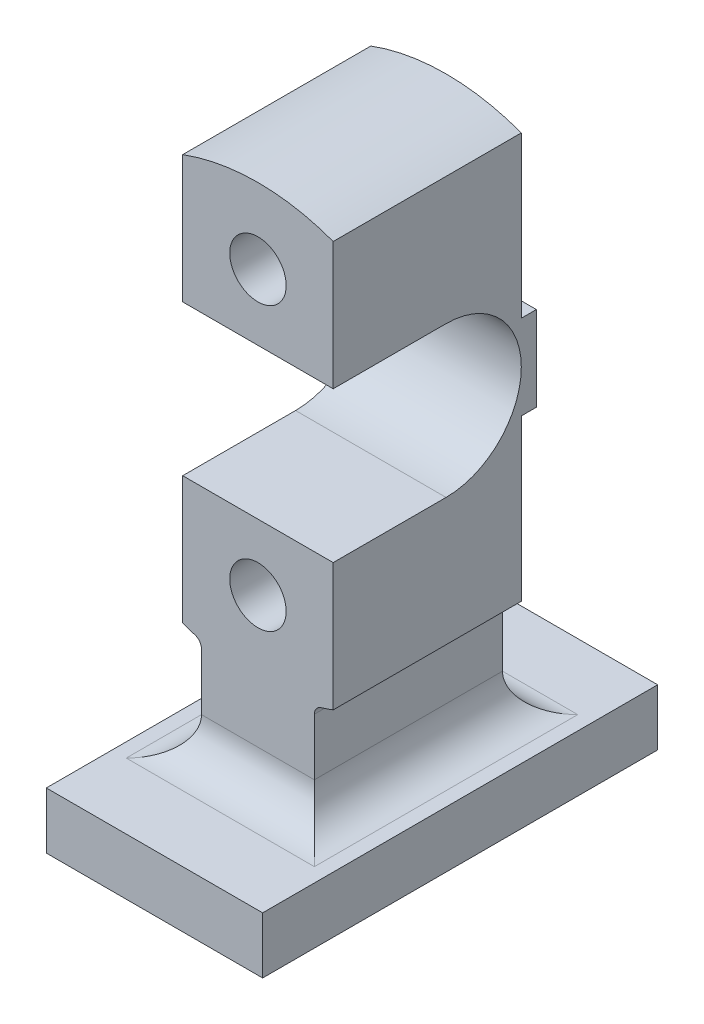
ISO-10303-21;
HEADER;
FILE_DESCRIPTION(('STEP AP214'),'2;1');
FILE_NAME('part.step','',(''),(''),'','','');
FILE_SCHEMA(('AUTOMOTIVE_DESIGN { 1 0 10303 214 1 1 1 1 }'));
ENDSEC;
DATA;
#1=APPLICATION_CONTEXT('core data for automotive mechanical design processes');
#2=APPLICATION_PROTOCOL_DEFINITION('international standard','automotive_design',2000,#1);
#3=PRODUCT_CONTEXT('',#1,'mechanical');
#4=PRODUCT('Part','Part','',(#3));
#5=PRODUCT_RELATED_PRODUCT_CATEGORY('part','',(#4));
#6=PRODUCT_DEFINITION_FORMATION('','',#4);
#7=PRODUCT_DEFINITION_CONTEXT('part definition',#1,'design');
#8=PRODUCT_DEFINITION('design','',#6,#7);
#9=PRODUCT_DEFINITION_SHAPE('','',#8);
#10=(LENGTH_UNIT() NAMED_UNIT(*) SI_UNIT(.MILLI.,.METRE.));
#11=(NAMED_UNIT(*) PLANE_ANGLE_UNIT() SI_UNIT($,.RADIAN.));
#12=(NAMED_UNIT(*) SI_UNIT($,.STERADIAN.) SOLID_ANGLE_UNIT());
#13=UNCERTAINTY_MEASURE_WITH_UNIT(LENGTH_MEASURE(1.E-05),#10,'distance_accuracy_value','');
#14=(GEOMETRIC_REPRESENTATION_CONTEXT(3) GLOBAL_UNCERTAINTY_ASSIGNED_CONTEXT((#13)) GLOBAL_UNIT_ASSIGNED_CONTEXT((#10,
#11,#12)) REPRESENTATION_CONTEXT('',''));
#15=CARTESIAN_POINT('',(0.,0.,0.));
#16=DIRECTION('',(0.,0.,1.));
#17=DIRECTION('',(1.,0.,0.));
#18=AXIS2_PLACEMENT_3D('',#15,#16,#17);
#19=CARTESIAN_POINT('',(-57.5,304.92444078651,-55.));
#20=DIRECTION('',(0.,0.,1.));
#21=DIRECTION('',(0.,-1.,0.));
#22=AXIS2_PLACEMENT_3D('',#19,#20,#21);
#23=PLANE('',#22);
#24=DIRECTION('',(1.,0.,0.));
#25=VECTOR('',#24,1.);
#26=CARTESIAN_POINT('',(-57.5,220.,-55.));
#27=LINE('',#26,#25);
#28=CARTESIAN_POINT('',(-40.,220.,-55.));
#29=VERTEX_POINT('',#28);
#30=CARTESIAN_POINT('',(40.,220.,-55.));
#31=VERTEX_POINT('',#30);
#32=EDGE_CURVE('E360',#29,#31,#27,.T.);
#33=ORIENTED_EDGE('',*,*,#32,.T.);
#34=DIRECTION('',(0.,-1.,0.));
#35=VECTOR('',#34,1.);
#36=CARTESIAN_POINT('',(40.,304.92444078651,-55.));
#37=LINE('',#36,#35);
#38=CARTESIAN_POINT('',(40.,287.819293264239,-55.));
#39=VERTEX_POINT('',#38);
#40=EDGE_CURVE('E228',#39,#31,#37,.T.);
#41=ORIENTED_EDGE('',*,*,#40,.F.);
#42=CARTESIAN_POINT('',(0.,180.,-55.));
#43=DIRECTION('',(0.,0.,1.));
#44=DIRECTION('',(0.,-1.,0.));
#45=AXIS2_PLACEMENT_3D('',#42,#43,#44);
#46=CIRCLE('',#45,115.);
#47=CARTESIAN_POINT('',(-40.,287.819293264239,-55.));
#48=VERTEX_POINT('',#47);
#49=EDGE_CURVE('E253',#39,#48,#46,.T.);
#50=ORIENTED_EDGE('',*,*,#49,.T.);
#51=DIRECTION('',(0.,1.,0.));
#52=VECTOR('',#51,1.);
#53=CARTESIAN_POINT('',(-40.,0.,-55.));
#54=LINE('',#53,#52);
#55=EDGE_CURVE('E245',#29,#48,#54,.T.);
#56=ORIENTED_EDGE('',*,*,#55,.F.);
#57=EDGE_LOOP('',(#33,#41,#50,#56));
#58=FACE_BOUND('',#57,.T.);
#59=CARTESIAN_POINT('',(0.,255.,-55.));
#60=DIRECTION('',(0.,0.,1.));
#61=DIRECTION('',(0.,-1.,0.));
#62=AXIS2_PLACEMENT_3D('',#59,#60,#61);
#63=CIRCLE('',#62,15.);
#64=CARTESIAN_POINT('',(15.,255.,-55.));
#65=VERTEX_POINT('',#64);
#66=EDGE_CURVE('E256',#65,#65,#63,.F.);
#67=ORIENTED_EDGE('',*,*,#66,.T.);
#68=EDGE_LOOP('',(#67));
#69=FACE_BOUND('',#68,.T.);
#70=ADVANCED_FACE('F42',(#58,#69),#23,.T.);
#71=CARTESIAN_POINT('',(-57.5,304.92444078651,-155.));
#72=DIRECTION('',(0.,0.,-1.));
#73=DIRECTION('',(0.,1.,0.));
#74=AXIS2_PLACEMENT_3D('',#71,#72,#73);
#75=PLANE('',#74);
#76=DIRECTION('',(1.,0.,0.));
#77=VECTOR('',#76,1.);
#78=CARTESIAN_POINT('',(-85.7055795281057,157.5,-155.));
#79=LINE('',#78,#77);
#80=CARTESIAN_POINT('',(-40.,157.5,-155.));
#81=VERTEX_POINT('',#80);
#82=CARTESIAN_POINT('',(40.,157.5,-155.));
#83=VERTEX_POINT('',#82);
#84=EDGE_CURVE('E65',#81,#83,#79,.T.);
#85=ORIENTED_EDGE('',*,*,#84,.T.);
#86=DIRECTION('',(0.,1.,0.));
#87=VECTOR('',#86,1.);
#88=CARTESIAN_POINT('',(40.,304.92444078651,-155.));
#89=LINE('',#88,#87);
#90=CARTESIAN_POINT('',(40.,72.1807067357609,-155.));
#91=VERTEX_POINT('',#90);
#92=EDGE_CURVE('E238',#91,#83,#89,.T.);
#93=ORIENTED_EDGE('',*,*,#92,.F.);
#94=CARTESIAN_POINT('',(0.,180.,-155.));
#95=DIRECTION('',(0.,0.,-1.));
#96=DIRECTION('',(0.,1.,0.));
#97=AXIS2_PLACEMENT_3D('',#94,#95,#96);
#98=CIRCLE('',#97,115.);
#99=CARTESIAN_POINT('',(33.5416666666667,70.0001972855304,-155.));
#100=VERTEX_POINT('',#99);
#101=EDGE_CURVE('E291',#100,#91,#98,.F.);
#102=ORIENTED_EDGE('',*,*,#101,.F.);
#103=CARTESIAN_POINT('',(35.,65.21759716751,-155.));
#104=DIRECTION('',(0.,0.,-1.));
#105=DIRECTION('',(0.,1.,0.));
#106=AXIS2_PLACEMENT_3D('',#103,#104,#105);
#107=CIRCLE('',#106,5.);
#108=CARTESIAN_POINT('',(30.,65.21759716751,-155.));
#109=VERTEX_POINT('',#108);
#110=EDGE_CURVE('E288',#109,#100,#107,.T.);
#111=ORIENTED_EDGE('',*,*,#110,.F.);
#112=DIRECTION('',(0.,-1.,0.));
#113=VECTOR('',#112,1.);
#114=CARTESIAN_POINT('',(30.,0.,-155.));
#115=LINE('',#114,#113);
#116=CARTESIAN_POINT('',(30.,35.,-155.));
#117=VERTEX_POINT('',#116);
#118=EDGE_CURVE('E285',#109,#117,#115,.T.);
#119=ORIENTED_EDGE('',*,*,#118,.T.);
#120=DIRECTION('',(1.,0.,0.));
#121=VECTOR('',#120,1.);
#122=CARTESIAN_POINT('',(-30.,35.,-155.));
#123=LINE('',#122,#121);
#124=CARTESIAN_POINT('',(-30.,35.,-155.));
#125=VERTEX_POINT('',#124);
#126=EDGE_CURVE('E330',#117,#125,#123,.F.);
#127=ORIENTED_EDGE('',*,*,#126,.T.);
#128=DIRECTION('',(0.,-1.,0.));
#129=VECTOR('',#128,1.);
#130=CARTESIAN_POINT('',(-30.,0.,-155.));
#131=LINE('',#130,#129);
#132=CARTESIAN_POINT('',(-30.,65.21759716751,-155.));
#133=VERTEX_POINT('',#132);
#134=EDGE_CURVE('E276',#133,#125,#131,.T.);
#135=ORIENTED_EDGE('',*,*,#134,.F.);
#136=CARTESIAN_POINT('',(-35.,65.21759716751,-155.));
#137=DIRECTION('',(0.,0.,-1.));
#138=DIRECTION('',(0.,1.,0.));
#139=AXIS2_PLACEMENT_3D('',#136,#137,#138);
#140=CIRCLE('',#139,5.);
#141=CARTESIAN_POINT('',(-33.5416666666667,70.0001972855304,-155.));
#142=VERTEX_POINT('',#141);
#143=EDGE_CURVE('E273',#142,#133,#140,.T.);
#144=ORIENTED_EDGE('',*,*,#143,.F.);
#145=CARTESIAN_POINT('',(0.,180.,-155.));
#146=DIRECTION('',(0.,0.,-1.));
#147=DIRECTION('',(0.,1.,0.));
#148=AXIS2_PLACEMENT_3D('',#145,#146,#147);
#149=CIRCLE('',#148,115.);
#150=CARTESIAN_POINT('',(-40.,72.1807067357609,-155.));
#151=VERTEX_POINT('',#150);
#152=EDGE_CURVE('E269',#151,#142,#149,.F.);
#153=ORIENTED_EDGE('',*,*,#152,.F.);
#154=DIRECTION('',(0.,-1.,0.));
#155=VECTOR('',#154,1.);
#156=CARTESIAN_POINT('',(-40.,0.,-155.));
#157=LINE('',#156,#155);
#158=EDGE_CURVE('E270',#81,#151,#157,.T.);
#159=ORIENTED_EDGE('',*,*,#158,.F.);
#160=EDGE_LOOP('',(#85,#93,#102,#111,#119,#127,#135,#144,#153,#159));
#161=FACE_BOUND('',#160,.T.);
#162=CARTESIAN_POINT('',(0.,105.,-155.));
#163=DIRECTION('',(0.,0.,-1.));
#164=DIRECTION('',(0.,1.,0.));
#165=AXIS2_PLACEMENT_3D('',#162,#163,#164);
#166=CIRCLE('',#165,15.);
#167=CARTESIAN_POINT('',(15.,105.,-155.));
#168=VERTEX_POINT('',#167);
#169=EDGE_CURVE('E265',#168,#168,#166,.F.);
#170=ORIENTED_EDGE('',*,*,#169,.T.);
#171=EDGE_LOOP('',(#170));
#172=FACE_BOUND('',#171,.T.);
#173=ADVANCED_FACE('F444',(#161,#172),#75,.T.);
#174=CARTESIAN_POINT('',(0.,105.,-210.));
#175=DIRECTION('',(0.,0.,1.));
#176=DIRECTION('',(1.,0.,0.));
#177=AXIS2_PLACEMENT_3D('',#174,#175,#176);
#178=CYLINDRICAL_SURFACE('',#177,15.);
#179=CARTESIAN_POINT('',(0.,105.,-55.));
#180=DIRECTION('',(0.,0.,1.));
#181=DIRECTION('',(0.,-1.,0.));
#182=AXIS2_PLACEMENT_3D('',#179,#180,#181);
#183=CIRCLE('',#182,15.);
#184=CARTESIAN_POINT('',(15.,105.,-55.));
#185=VERTEX_POINT('',#184);
#186=EDGE_CURVE('E241',#185,#185,#183,.F.);
#187=CARTESIAN_POINT('',(15.,105.,-55.));
#188=CARTESIAN_POINT('',(15.,105.,-56.0416666666667));
#189=CARTESIAN_POINT('',(15.,105.,-57.0833333333333));
#190=CARTESIAN_POINT('',(15.,105.,-59.1666666666667));
#191=CARTESIAN_POINT('',(15.,105.,-60.2083333333334));
#192=CARTESIAN_POINT('',(15.,105.,-62.2916666666667));
#193=CARTESIAN_POINT('',(15.,105.,-63.3333333333333));
#194=CARTESIAN_POINT('',(15.,105.,-65.4166666666667));
#195=CARTESIAN_POINT('',(15.,105.,-66.4583333333334));
#196=CARTESIAN_POINT('',(15.,105.,-68.5416666666667));
#197=CARTESIAN_POINT('',(15.,105.,-69.5833333333334));
#198=CARTESIAN_POINT('',(15.,105.,-71.6666666666667));
#199=CARTESIAN_POINT('',(15.,105.,-72.7083333333333));
#200=CARTESIAN_POINT('',(15.,105.,-74.7916666666667));
#201=CARTESIAN_POINT('',(15.,105.,-75.8333333333333));
#202=CARTESIAN_POINT('',(15.,105.,-77.9166666666667));
#203=CARTESIAN_POINT('',(15.,105.,-78.9583333333334));
#204=CARTESIAN_POINT('',(15.,105.,-81.0416666666667));
#205=CARTESIAN_POINT('',(15.,105.,-82.0833333333334));
#206=CARTESIAN_POINT('',(15.,105.,-84.1666666666667));
#207=CARTESIAN_POINT('',(15.,105.,-85.2083333333334));
#208=CARTESIAN_POINT('',(15.,105.,-87.2916666666667));
#209=CARTESIAN_POINT('',(15.,105.,-88.3333333333334));
#210=CARTESIAN_POINT('',(15.,105.,-90.4166666666667));
#211=CARTESIAN_POINT('',(15.,105.,-91.4583333333334));
#212=CARTESIAN_POINT('',(15.,105.,-93.5416666666667));
#213=CARTESIAN_POINT('',(15.,105.,-94.5833333333334));
#214=CARTESIAN_POINT('',(15.,105.,-96.6666666666667));
#215=CARTESIAN_POINT('',(15.,105.,-97.7083333333334));
#216=CARTESIAN_POINT('',(15.,105.,-99.7916666666667));
#217=CARTESIAN_POINT('',(15.,105.,-100.833333333333));
#218=CARTESIAN_POINT('',(15.,105.,-102.916666666667));
#219=CARTESIAN_POINT('',(15.,105.,-103.958333333333));
#220=CARTESIAN_POINT('',(15.,105.,-106.041666666667));
#221=CARTESIAN_POINT('',(15.,105.,-107.083333333333));
#222=CARTESIAN_POINT('',(15.,105.,-109.166666666667));
#223=CARTESIAN_POINT('',(15.,105.,-110.208333333333));
#224=CARTESIAN_POINT('',(15.,105.,-112.291666666667));
#225=CARTESIAN_POINT('',(15.,105.,-113.333333333333));
#226=CARTESIAN_POINT('',(15.,105.,-115.416666666667));
#227=CARTESIAN_POINT('',(15.,105.,-116.458333333333));
#228=CARTESIAN_POINT('',(15.,105.,-118.541666666667));
#229=CARTESIAN_POINT('',(15.,105.,-119.583333333333));
#230=CARTESIAN_POINT('',(15.,105.,-121.666666666667));
#231=CARTESIAN_POINT('',(15.,105.,-122.708333333333));
#232=CARTESIAN_POINT('',(15.,105.,-124.791666666667));
#233=CARTESIAN_POINT('',(15.,105.,-125.833333333333));
#234=CARTESIAN_POINT('',(15.,105.,-127.916666666667));
#235=CARTESIAN_POINT('',(15.,105.,-128.958333333333));
#236=CARTESIAN_POINT('',(15.,105.,-131.041666666667));
#237=CARTESIAN_POINT('',(15.,105.,-132.083333333333));
#238=CARTESIAN_POINT('',(15.,105.,-134.166666666667));
#239=CARTESIAN_POINT('',(15.,105.,-135.208333333333));
#240=CARTESIAN_POINT('',(15.,105.,-137.291666666667));
#241=CARTESIAN_POINT('',(15.,105.,-138.333333333333));
#242=CARTESIAN_POINT('',(15.,105.,-140.416666666667));
#243=CARTESIAN_POINT('',(15.,105.,-141.458333333333));
#244=CARTESIAN_POINT('',(15.,105.,-143.541666666667));
#245=CARTESIAN_POINT('',(15.,105.,-144.583333333333));
#246=CARTESIAN_POINT('',(15.,105.,-146.666666666667));
#247=CARTESIAN_POINT('',(15.,105.,-147.708333333333));
#248=CARTESIAN_POINT('',(15.,105.,-149.791666666667));
#249=CARTESIAN_POINT('',(15.,105.,-150.833333333333));
#250=CARTESIAN_POINT('',(15.,105.,-152.916666666667));
#251=CARTESIAN_POINT('',(15.,105.,-153.958333333333));
#252=CARTESIAN_POINT('',(15.,105.,-155.));
#253=B_SPLINE_CURVE_WITH_KNOTS('',3,(#187,#188,#189,#190,#191,#192,#193,#194,#195,#196,#197,
#198,#199,#200,#201,#202,#203,#204,#205,#206,#207,#208,#209,#210,#211,#212,#213,#214,#215,#216,
#217,#218,#219,#220,#221,#222,#223,#224,#225,#226,#227,#228,#229,#230,#231,#232,#233,#234,#235,
#236,#237,#238,#239,#240,#241,#242,#243,#244,#245,#246,#247,#248,#249,#250,#251,#252),
.UNSPECIFIED.,.F.,.F.,(4,2,2,2,2,2,2,2,2,2,2,2,2,2,2,2,2,2,2,2,2,2,2,2,2,2,2,2,2,2,2,2,4),(0.,
3.12499999999999,6.25000000000001,9.37499999999999,12.5,15.625,18.75,21.875,25.,28.125,31.25,
34.375,37.5,40.625,43.75,46.875,50.,53.125,56.25,59.375,62.5,65.625,68.75,71.875,75.,78.125,
81.25,84.375,87.5,90.625,93.75,96.875,100.),.UNSPECIFIED.);
#254=EDGE_CURVE('BSEAM450',#185,#168,#253,.T.);
#255=ORIENTED_EDGE('',*,*,#186,.F.);
#256=ORIENTED_EDGE('',*,*,#169,.F.);
#257=ORIENTED_EDGE('',*,*,#254,.T.);
#258=ORIENTED_EDGE('',*,*,#254,.F.);
#259=EDGE_LOOP('',(#255,#257,#256,#258));
#260=FACE_BOUND('',#259,.T.);
#261=ADVANCED_FACE('F450',(#260),#178,.F.);
#262=DIRECTION('',(1.,0.,0.));
#263=VECTOR('',#262,1.);
#264=CARTESIAN_POINT('',(-85.7055795281057,202.5,-155.));
#265=LINE('',#264,#263);
#266=CARTESIAN_POINT('',(-40.,202.5,-155.));
#267=VERTEX_POINT('',#266);
#268=CARTESIAN_POINT('',(40.,202.5,-155.));
#269=VERTEX_POINT('',#268);
#270=EDGE_CURVE('E381',#267,#269,#265,.T.);
#271=ORIENTED_EDGE('',*,*,#270,.F.);
#272=CARTESIAN_POINT('',(-40.,287.819293264239,-155.));
#273=VERTEX_POINT('',#272);
#274=EDGE_CURVE('E266',#273,#267,#157,.T.);
#275=ORIENTED_EDGE('',*,*,#274,.F.);
#276=CARTESIAN_POINT('',(0.,180.,-155.));
#277=DIRECTION('',(0.,0.,-1.));
#278=DIRECTION('',(0.,1.,0.));
#279=AXIS2_PLACEMENT_3D('',#276,#277,#278);
#280=CIRCLE('',#279,115.);
#281=CARTESIAN_POINT('',(40.,287.819293264239,-155.));
#282=VERTEX_POINT('',#281);
#283=EDGE_CURVE('E279',#273,#282,#280,.T.);
#284=ORIENTED_EDGE('',*,*,#283,.T.);
#285=EDGE_CURVE('E231',#269,#282,#89,.T.);
#286=ORIENTED_EDGE('',*,*,#285,.F.);
#287=EDGE_LOOP('',(#271,#275,#284,#286));
#288=FACE_BOUND('',#287,.T.);
#289=CARTESIAN_POINT('',(0.,255.,-155.));
#290=DIRECTION('',(0.,0.,-1.));
#291=DIRECTION('',(0.,1.,0.));
#292=AXIS2_PLACEMENT_3D('',#289,#290,#291);
#293=CIRCLE('',#292,15.);
#294=CARTESIAN_POINT('',(15.,255.,-155.));
#295=VERTEX_POINT('',#294);
#296=EDGE_CURVE('E282',#295,#295,#293,.F.);
#297=ORIENTED_EDGE('',*,*,#296,.T.);
#298=EDGE_LOOP('',(#297));
#299=FACE_BOUND('',#298,.T.);
#300=ADVANCED_FACE('F453',(#288,#299),#75,.T.);
#301=DIRECTION('',(1.,0.,0.));
#302=VECTOR('',#301,1.);
#303=CARTESIAN_POINT('',(-57.5,140.,-55.));
#304=LINE('',#303,#302);
#305=CARTESIAN_POINT('',(-40.,140.,-55.));
#306=VERTEX_POINT('',#305);
#307=CARTESIAN_POINT('',(40.,140.,-55.));
#308=VERTEX_POINT('',#307);
#309=EDGE_CURVE('E201',#306,#308,#304,.T.);
#310=ORIENTED_EDGE('',*,*,#309,.F.);
#311=CARTESIAN_POINT('',(-40.,72.1807067357609,-55.));
#312=VERTEX_POINT('',#311);
#313=EDGE_CURVE('E242',#312,#306,#54,.T.);
#314=ORIENTED_EDGE('',*,*,#313,.F.);
#315=CARTESIAN_POINT('',(0.,180.,-55.));
#316=DIRECTION('',(0.,0.,1.));
#317=DIRECTION('',(0.,-1.,0.));
#318=AXIS2_PLACEMENT_3D('',#315,#316,#317);
#319=CIRCLE('',#318,115.);
#320=CARTESIAN_POINT('',(-33.5416666666667,70.0001972855304,-55.));
#321=VERTEX_POINT('',#320);
#322=EDGE_CURVE('E244',#321,#312,#319,.F.);
#323=ORIENTED_EDGE('',*,*,#322,.F.);
#324=CARTESIAN_POINT('',(-35.,65.21759716751,-55.));
#325=DIRECTION('',(0.,0.,1.));
#326=DIRECTION('',(0.,-1.,0.));
#327=AXIS2_PLACEMENT_3D('',#324,#325,#326);
#328=CIRCLE('',#327,5.);
#329=CARTESIAN_POINT('',(-30.,65.21759716751,-55.));
#330=VERTEX_POINT('',#329);
#331=EDGE_CURVE('E248',#330,#321,#328,.T.);
#332=ORIENTED_EDGE('',*,*,#331,.F.);
#333=DIRECTION('',(0.,1.,0.));
#334=VECTOR('',#333,1.);
#335=CARTESIAN_POINT('',(-30.,0.,-55.));
#336=LINE('',#335,#334);
#337=CARTESIAN_POINT('',(-30.,35.,-55.));
#338=VERTEX_POINT('',#337);
#339=EDGE_CURVE('E251',#338,#330,#336,.T.);
#340=ORIENTED_EDGE('',*,*,#339,.F.);
#341=DIRECTION('',(1.,0.,0.));
#342=VECTOR('',#341,1.);
#343=CARTESIAN_POINT('',(30.,35.,-55.));
#344=LINE('',#343,#342);
#345=CARTESIAN_POINT('',(30.,35.,-55.));
#346=VERTEX_POINT('',#345);
#347=EDGE_CURVE('E335',#338,#346,#344,.T.);
#348=ORIENTED_EDGE('',*,*,#347,.T.);
#349=DIRECTION('',(0.,1.,0.));
#350=VECTOR('',#349,1.);
#351=CARTESIAN_POINT('',(30.,0.,-55.));
#352=LINE('',#351,#350);
#353=CARTESIAN_POINT('',(30.,65.21759716751,-55.));
#354=VERTEX_POINT('',#353);
#355=EDGE_CURVE('E259',#346,#354,#352,.T.);
#356=ORIENTED_EDGE('',*,*,#355,.T.);
#357=CARTESIAN_POINT('',(35.,65.21759716751,-55.));
#358=DIRECTION('',(0.,0.,1.));
#359=DIRECTION('',(0.,-1.,0.));
#360=AXIS2_PLACEMENT_3D('',#357,#358,#359);
#361=CIRCLE('',#360,5.);
#362=CARTESIAN_POINT('',(33.5416666666667,70.0001972855304,-55.));
#363=VERTEX_POINT('',#362);
#364=EDGE_CURVE('E261',#363,#354,#361,.T.);
#365=ORIENTED_EDGE('',*,*,#364,.F.);
#366=CARTESIAN_POINT('',(0.,180.,-55.));
#367=DIRECTION('',(0.,0.,1.));
#368=DIRECTION('',(0.,-1.,0.));
#369=AXIS2_PLACEMENT_3D('',#366,#367,#368);
#370=CIRCLE('',#369,115.);
#371=CARTESIAN_POINT('',(40.,72.1807067357609,-55.));
#372=VERTEX_POINT('',#371);
#373=EDGE_CURVE('E226',#372,#363,#370,.F.);
#374=ORIENTED_EDGE('',*,*,#373,.F.);
#375=EDGE_CURVE('E217',#308,#372,#37,.T.);
#376=ORIENTED_EDGE('',*,*,#375,.F.);
#377=EDGE_LOOP('',(#310,#314,#323,#332,#340,#348,#356,#365,#374,#376));
#378=FACE_BOUND('',#377,.T.);
#379=ORIENTED_EDGE('',*,*,#186,.T.);
#380=EDGE_LOOP('',(#379));
#381=FACE_BOUND('',#380,.T.);
#382=ADVANCED_FACE('F223',(#378,#381),#23,.T.);
#383=CARTESIAN_POINT('',(30.,0.,-210.));
#384=DIRECTION('',(-1.,0.,0.));
#385=DIRECTION('',(0.,-1.,0.));
#386=AXIS2_PLACEMENT_3D('',#383,#384,#385);
#387=PLANE('',#386);
#388=ORIENTED_EDGE('',*,*,#355,.F.);
#389=DIRECTION('',(0.,0.,1.));
#390=VECTOR('',#389,1.);
#391=CARTESIAN_POINT('',(30.,35.,-210.));
#392=LINE('',#391,#390);
#393=EDGE_CURVE('E333',#346,#117,#392,.F.);
#394=ORIENTED_EDGE('',*,*,#393,.T.);
#395=ORIENTED_EDGE('',*,*,#118,.F.);
#396=DIRECTION('',(0.,0.,1.));
#397=VECTOR('',#396,1.);
#398=CARTESIAN_POINT('',(30.,65.21759716751,-210.));
#399=LINE('',#398,#397);
#400=EDGE_CURVE('E304',#109,#354,#399,.T.);
#401=ORIENTED_EDGE('',*,*,#400,.T.);
#402=EDGE_LOOP('',(#388,#394,#395,#401));
#403=FACE_BOUND('',#402,.T.);
#404=ADVANCED_FACE('F457',(#403),#387,.F.);
#405=CARTESIAN_POINT('',(35.,65.21759716751,-210.));
#406=DIRECTION('',(0.,0.,1.));
#407=DIRECTION('',(1.,0.,0.));
#408=AXIS2_PLACEMENT_3D('',#405,#406,#407);
#409=CYLINDRICAL_SURFACE('',#408,5.);
#410=ORIENTED_EDGE('',*,*,#400,.F.);
#411=ORIENTED_EDGE('',*,*,#110,.T.);
#412=DIRECTION('',(0.,0.,1.));
#413=VECTOR('',#412,1.);
#414=CARTESIAN_POINT('',(33.5416666666667,70.0001972855304,-210.));
#415=LINE('',#414,#413);
#416=EDGE_CURVE('E301',#100,#363,#415,.T.);
#417=ORIENTED_EDGE('',*,*,#416,.T.);
#418=ORIENTED_EDGE('',*,*,#364,.T.);
#419=EDGE_LOOP('',(#410,#411,#417,#418));
#420=FACE_BOUND('',#419,.T.);
#421=ADVANCED_FACE('F462',(#420),#409,.F.);
#422=CARTESIAN_POINT('',(0.,180.,-210.));
#423=DIRECTION('',(0.,0.,1.));
#424=DIRECTION('',(1.,0.,0.));
#425=AXIS2_PLACEMENT_3D('',#422,#423,#424);
#426=CYLINDRICAL_SURFACE('',#425,115.);
#427=ORIENTED_EDGE('',*,*,#416,.F.);
#428=ORIENTED_EDGE('',*,*,#101,.T.);
#429=DIRECTION('',(0.,0.,1.));
#430=VECTOR('',#429,1.);
#431=CARTESIAN_POINT('',(40.,72.1807067357609,-210.));
#432=LINE('',#431,#430);
#433=EDGE_CURVE('E299',#91,#372,#432,.T.);
#434=ORIENTED_EDGE('',*,*,#433,.T.);
#435=ORIENTED_EDGE('',*,*,#373,.T.);
#436=EDGE_LOOP('',(#427,#428,#434,#435));
#437=FACE_BOUND('',#436,.T.);
#438=ADVANCED_FACE('F492',(#437),#426,.T.);
#439=CARTESIAN_POINT('',(40.,0.,-210.));
#440=DIRECTION('',(-1.,0.,0.));
#441=DIRECTION('',(0.,-1.,0.));
#442=AXIS2_PLACEMENT_3D('',#439,#440,#441);
#443=PLANE('',#442);
#444=ORIENTED_EDGE('',*,*,#40,.T.);
#445=DIRECTION('',(0.,0.,1.));
#446=VECTOR('',#445,1.);
#447=CARTESIAN_POINT('',(40.,220.,-115.));
#448=LINE('',#447,#446);
#449=CARTESIAN_POINT('',(40.,220.,-115.));
#450=VERTEX_POINT('',#449);
#451=EDGE_CURVE('E211',#450,#31,#448,.T.);
#452=ORIENTED_EDGE('',*,*,#451,.F.);
#453=CARTESIAN_POINT('',(40.,180.,-115.));
#454=DIRECTION('',(-1.,0.,0.));
#455=DIRECTION('',(0.,-1.,0.));
#456=AXIS2_PLACEMENT_3D('',#453,#454,#455);
#457=CIRCLE('',#456,40.);
#458=CARTESIAN_POINT('',(40.,140.,-115.));
#459=VERTEX_POINT('',#458);
#460=EDGE_CURVE('E221',#450,#459,#457,.T.);
#461=ORIENTED_EDGE('',*,*,#460,.T.);
#462=DIRECTION('',(0.,0.,-1.));
#463=VECTOR('',#462,1.);
#464=CARTESIAN_POINT('',(40.,140.,-55.));
#465=LINE('',#464,#463);
#466=EDGE_CURVE('E204',#308,#459,#465,.T.);
#467=ORIENTED_EDGE('',*,*,#466,.F.);
#468=ORIENTED_EDGE('',*,*,#375,.T.);
#469=ORIENTED_EDGE('',*,*,#433,.F.);
#470=ORIENTED_EDGE('',*,*,#92,.T.);
#471=DIRECTION('',(0.,0.,-1.));
#472=VECTOR('',#471,1.);
#473=CARTESIAN_POINT('',(40.,157.5,-163.));
#474=LINE('',#473,#472);
#475=CARTESIAN_POINT('',(40.,157.5,-163.));
#476=VERTEX_POINT('',#475);
#477=EDGE_CURVE('E363',#83,#476,#474,.T.);
#478=ORIENTED_EDGE('',*,*,#477,.T.);
#479=DIRECTION('',(0.,1.,0.));
#480=VECTOR('',#479,1.);
#481=CARTESIAN_POINT('',(40.,202.5,-163.));
#482=LINE('',#481,#480);
#483=CARTESIAN_POINT('',(40.,202.5,-163.));
#484=VERTEX_POINT('',#483);
#485=EDGE_CURVE('E372',#476,#484,#482,.T.);
#486=ORIENTED_EDGE('',*,*,#485,.T.);
#487=DIRECTION('',(0.,0.,1.));
#488=VECTOR('',#487,1.);
#489=CARTESIAN_POINT('',(40.,202.5,-155.));
#490=LINE('',#489,#488);
#491=EDGE_CURVE('E368',#484,#269,#490,.T.);
#492=ORIENTED_EDGE('',*,*,#491,.T.);
#493=ORIENTED_EDGE('',*,*,#285,.T.);
#494=DIRECTION('',(0.,0.,1.));
#495=VECTOR('',#494,1.);
#496=CARTESIAN_POINT('',(40.,287.819293264239,-210.));
#497=LINE('',#496,#495);
#498=EDGE_CURVE('E295',#282,#39,#497,.T.);
#499=ORIENTED_EDGE('',*,*,#498,.T.);
#500=EDGE_LOOP('',(#444,#452,#461,#467,#468,#469,#470,#478,#486,#492,#493,#499));
#501=FACE_BOUND('',#500,.T.);
#502=ADVANCED_FACE('F215',(#501),#443,.F.);
#503=CARTESIAN_POINT('',(-40.,0.,-210.));
#504=DIRECTION('',(-1.,0.,0.));
#505=DIRECTION('',(0.,-1.,0.));
#506=AXIS2_PLACEMENT_3D('',#503,#504,#505);
#507=PLANE('',#506);
#508=DIRECTION('',(0.,0.,-1.));
#509=VECTOR('',#508,1.);
#510=CARTESIAN_POINT('',(-40.,220.,-210.));
#511=LINE('',#510,#509);
#512=CARTESIAN_POINT('',(-40.,220.,-115.));
#513=VERTEX_POINT('',#512);
#514=EDGE_CURVE('E12',#29,#513,#511,.T.);
#515=ORIENTED_EDGE('',*,*,#514,.F.);
#516=ORIENTED_EDGE('',*,*,#55,.T.);
#517=DIRECTION('',(0.,0.,1.));
#518=VECTOR('',#517,1.);
#519=CARTESIAN_POINT('',(-40.,287.819293264239,-210.));
#520=LINE('',#519,#518);
#521=EDGE_CURVE('E294',#273,#48,#520,.T.);
#522=ORIENTED_EDGE('',*,*,#521,.F.);
#523=ORIENTED_EDGE('',*,*,#274,.T.);
#524=DIRECTION('',(0.,0.,1.));
#525=VECTOR('',#524,1.);
#526=CARTESIAN_POINT('',(-40.,202.5,-155.));
#527=LINE('',#526,#525);
#528=CARTESIAN_POINT('',(-40.,202.5,-163.));
#529=VERTEX_POINT('',#528);
#530=EDGE_CURVE('E379',#529,#267,#527,.T.);
#531=ORIENTED_EDGE('',*,*,#530,.F.);
#532=DIRECTION('',(0.,1.,0.));
#533=VECTOR('',#532,1.);
#534=CARTESIAN_POINT('',(-40.,202.5,-163.));
#535=LINE('',#534,#533);
#536=CARTESIAN_POINT('',(-40.,157.5,-163.));
#537=VERTEX_POINT('',#536);
#538=EDGE_CURVE('E383',#537,#529,#535,.T.);
#539=ORIENTED_EDGE('',*,*,#538,.F.);
#540=DIRECTION('',(0.,0.,-1.));
#541=VECTOR('',#540,1.);
#542=CARTESIAN_POINT('',(-40.,157.5,-163.));
#543=LINE('',#542,#541);
#544=EDGE_CURVE('E371',#81,#537,#543,.T.);
#545=ORIENTED_EDGE('',*,*,#544,.F.);
#546=ORIENTED_EDGE('',*,*,#158,.T.);
#547=DIRECTION('',(0.,0.,1.));
#548=VECTOR('',#547,1.);
#549=CARTESIAN_POINT('',(-40.,72.1807067357609,-210.));
#550=LINE('',#549,#548);
#551=EDGE_CURVE('E313',#151,#312,#550,.T.);
#552=ORIENTED_EDGE('',*,*,#551,.T.);
#553=ORIENTED_EDGE('',*,*,#313,.T.);
#554=DIRECTION('',(0.,0.,1.));
#555=VECTOR('',#554,1.);
#556=CARTESIAN_POINT('',(-40.,140.,-210.));
#557=LINE('',#556,#555);
#558=CARTESIAN_POINT('',(-40.,140.,-115.));
#559=VERTEX_POINT('',#558);
#560=EDGE_CURVE('E207',#559,#306,#557,.T.);
#561=ORIENTED_EDGE('',*,*,#560,.F.);
#562=CARTESIAN_POINT('',(-40.,180.,-115.));
#563=DIRECTION('',(-1.,0.,0.));
#564=DIRECTION('',(0.,-1.,0.));
#565=AXIS2_PLACEMENT_3D('',#562,#563,#564);
#566=CIRCLE('',#565,40.);
#567=EDGE_CURVE('E50',#559,#513,#566,.F.);
#568=ORIENTED_EDGE('',*,*,#567,.T.);
#569=EDGE_LOOP('',(#515,#516,#522,#523,#531,#539,#545,#546,#552,#553,#561,#568));
#570=FACE_BOUND('',#569,.T.);
#571=ADVANCED_FACE('F353',(#570),#507,.T.);
#572=CARTESIAN_POINT('',(0.,180.,-210.));
#573=DIRECTION('',(0.,0.,1.));
#574=DIRECTION('',(1.,0.,0.));
#575=AXIS2_PLACEMENT_3D('',#572,#573,#574);
#576=CYLINDRICAL_SURFACE('',#575,115.);
#577=ORIENTED_EDGE('',*,*,#551,.F.);
#578=ORIENTED_EDGE('',*,*,#152,.T.);
#579=DIRECTION('',(0.,0.,1.));
#580=VECTOR('',#579,1.);
#581=CARTESIAN_POINT('',(-33.5416666666667,70.0001972855304,-210.));
#582=LINE('',#581,#580);
#583=EDGE_CURVE('E310',#142,#321,#582,.T.);
#584=ORIENTED_EDGE('',*,*,#583,.T.);
#585=ORIENTED_EDGE('',*,*,#322,.T.);
#586=EDGE_LOOP('',(#577,#578,#584,#585));
#587=FACE_BOUND('',#586,.T.);
#588=ADVANCED_FACE('F505',(#587),#576,.T.);
#589=CARTESIAN_POINT('',(-35.,65.21759716751,-210.));
#590=DIRECTION('',(0.,0.,1.));
#591=DIRECTION('',(1.,0.,0.));
#592=AXIS2_PLACEMENT_3D('',#589,#590,#591);
#593=CYLINDRICAL_SURFACE('',#592,5.);
#594=ORIENTED_EDGE('',*,*,#583,.F.);
#595=ORIENTED_EDGE('',*,*,#143,.T.);
#596=DIRECTION('',(0.,0.,1.));
#597=VECTOR('',#596,1.);
#598=CARTESIAN_POINT('',(-30.,65.21759716751,-210.));
#599=LINE('',#598,#597);
#600=EDGE_CURVE('E307',#133,#330,#599,.T.);
#601=ORIENTED_EDGE('',*,*,#600,.T.);
#602=ORIENTED_EDGE('',*,*,#331,.T.);
#603=EDGE_LOOP('',(#594,#595,#601,#602));
#604=FACE_BOUND('',#603,.T.);
#605=ADVANCED_FACE('F501',(#604),#593,.F.);
#606=CARTESIAN_POINT('',(-30.,0.,-210.));
#607=DIRECTION('',(-1.,0.,0.));
#608=DIRECTION('',(0.,-1.,0.));
#609=AXIS2_PLACEMENT_3D('',#606,#607,#608);
#610=PLANE('',#609);
#611=ORIENTED_EDGE('',*,*,#134,.T.);
#612=DIRECTION('',(0.,0.,1.));
#613=VECTOR('',#612,1.);
#614=CARTESIAN_POINT('',(-30.,35.,-55.));
#615=LINE('',#614,#613);
#616=EDGE_CURVE('E337',#125,#338,#615,.T.);
#617=ORIENTED_EDGE('',*,*,#616,.T.);
#618=ORIENTED_EDGE('',*,*,#339,.T.);
#619=ORIENTED_EDGE('',*,*,#600,.F.);
#620=EDGE_LOOP('',(#611,#617,#618,#619));
#621=FACE_BOUND('',#620,.T.);
#622=ADVANCED_FACE('F484',(#621),#610,.T.);
#623=CARTESIAN_POINT('',(0.,180.,-210.));
#624=DIRECTION('',(0.,0.,1.));
#625=DIRECTION('',(1.,0.,0.));
#626=AXIS2_PLACEMENT_3D('',#623,#624,#625);
#627=CYLINDRICAL_SURFACE('',#626,115.);
#628=ORIENTED_EDGE('',*,*,#283,.F.);
#629=ORIENTED_EDGE('',*,*,#521,.T.);
#630=ORIENTED_EDGE('',*,*,#49,.F.);
#631=ORIENTED_EDGE('',*,*,#498,.F.);
#632=EDGE_LOOP('',(#628,#629,#630,#631));
#633=FACE_BOUND('',#632,.T.);
#634=ADVANCED_FACE('F478',(#633),#627,.T.);
#635=CARTESIAN_POINT('',(0.,255.,-210.));
#636=DIRECTION('',(0.,0.,1.));
#637=DIRECTION('',(1.,0.,0.));
#638=AXIS2_PLACEMENT_3D('',#635,#636,#637);
#639=CYLINDRICAL_SURFACE('',#638,15.);
#640=CARTESIAN_POINT('',(15.,255.,-55.));
#641=CARTESIAN_POINT('',(15.,255.,-56.0416666666667));
#642=CARTESIAN_POINT('',(15.,255.,-57.0833333333333));
#643=CARTESIAN_POINT('',(15.,255.,-59.1666666666667));
#644=CARTESIAN_POINT('',(15.,255.,-60.2083333333334));
#645=CARTESIAN_POINT('',(15.,255.,-62.2916666666667));
#646=CARTESIAN_POINT('',(15.,255.,-63.3333333333333));
#647=CARTESIAN_POINT('',(15.,255.,-65.4166666666667));
#648=CARTESIAN_POINT('',(15.,255.,-66.4583333333334));
#649=CARTESIAN_POINT('',(15.,255.,-68.5416666666667));
#650=CARTESIAN_POINT('',(15.,255.,-69.5833333333334));
#651=CARTESIAN_POINT('',(15.,255.,-71.6666666666667));
#652=CARTESIAN_POINT('',(15.,255.,-72.7083333333333));
#653=CARTESIAN_POINT('',(15.,255.,-74.7916666666667));
#654=CARTESIAN_POINT('',(15.,255.,-75.8333333333333));
#655=CARTESIAN_POINT('',(15.,255.,-77.9166666666667));
#656=CARTESIAN_POINT('',(15.,255.,-78.9583333333334));
#657=CARTESIAN_POINT('',(15.,255.,-81.0416666666667));
#658=CARTESIAN_POINT('',(15.,255.,-82.0833333333334));
#659=CARTESIAN_POINT('',(15.,255.,-84.1666666666667));
#660=CARTESIAN_POINT('',(15.,255.,-85.2083333333334));
#661=CARTESIAN_POINT('',(15.,255.,-87.2916666666667));
#662=CARTESIAN_POINT('',(15.,255.,-88.3333333333333));
#663=CARTESIAN_POINT('',(15.,255.,-90.4166666666667));
#664=CARTESIAN_POINT('',(15.,255.,-91.4583333333333));
#665=CARTESIAN_POINT('',(15.,255.,-93.5416666666667));
#666=CARTESIAN_POINT('',(15.,255.,-94.5833333333334));
#667=CARTESIAN_POINT('',(15.,255.,-96.6666666666667));
#668=CARTESIAN_POINT('',(15.,255.,-97.7083333333334));
#669=CARTESIAN_POINT('',(15.,255.,-99.7916666666667));
#670=CARTESIAN_POINT('',(15.,255.,-100.833333333333));
#671=CARTESIAN_POINT('',(15.,255.,-102.916666666667));
#672=CARTESIAN_POINT('',(15.,255.,-103.958333333333));
#673=CARTESIAN_POINT('',(15.,255.,-106.041666666667));
#674=CARTESIAN_POINT('',(15.,255.,-107.083333333333));
#675=CARTESIAN_POINT('',(15.,255.,-109.166666666667));
#676=CARTESIAN_POINT('',(15.,255.,-110.208333333333));
#677=CARTESIAN_POINT('',(15.,255.,-112.291666666667));
#678=CARTESIAN_POINT('',(15.,255.,-113.333333333333));
#679=CARTESIAN_POINT('',(15.,255.,-115.416666666667));
#680=CARTESIAN_POINT('',(15.,255.,-116.458333333333));
#681=CARTESIAN_POINT('',(15.,255.,-118.541666666667));
#682=CARTESIAN_POINT('',(15.,255.,-119.583333333333));
#683=CARTESIAN_POINT('',(15.,255.,-121.666666666667));
#684=CARTESIAN_POINT('',(15.,255.,-122.708333333333));
#685=CARTESIAN_POINT('',(15.,255.,-124.791666666667));
#686=CARTESIAN_POINT('',(15.,255.,-125.833333333333));
#687=CARTESIAN_POINT('',(15.,255.,-127.916666666667));
#688=CARTESIAN_POINT('',(15.,255.,-128.958333333333));
#689=CARTESIAN_POINT('',(15.,255.,-131.041666666667));
#690=CARTESIAN_POINT('',(15.,255.,-132.083333333333));
#691=CARTESIAN_POINT('',(15.,255.,-134.166666666667));
#692=CARTESIAN_POINT('',(15.,255.,-135.208333333333));
#693=CARTESIAN_POINT('',(15.,255.,-137.291666666667));
#694=CARTESIAN_POINT('',(15.,255.,-138.333333333333));
#695=CARTESIAN_POINT('',(15.,255.,-140.416666666667));
#696=CARTESIAN_POINT('',(15.,255.,-141.458333333333));
#697=CARTESIAN_POINT('',(15.,255.,-143.541666666667));
#698=CARTESIAN_POINT('',(15.,255.,-144.583333333333));
#699=CARTESIAN_POINT('',(15.,255.,-146.666666666667));
#700=CARTESIAN_POINT('',(15.,255.,-147.708333333333));
#701=CARTESIAN_POINT('',(15.,255.,-149.791666666667));
#702=CARTESIAN_POINT('',(15.,255.,-150.833333333333));
#703=CARTESIAN_POINT('',(15.,255.,-152.916666666667));
#704=CARTESIAN_POINT('',(15.,255.,-153.958333333333));
#705=CARTESIAN_POINT('',(15.,255.,-155.));
#706=B_SPLINE_CURVE_WITH_KNOTS('',3,(#640,#641,#642,#643,#644,#645,#646,#647,#648,#649,#650,
#651,#652,#653,#654,#655,#656,#657,#658,#659,#660,#661,#662,#663,#664,#665,#666,#667,#668,#669,
#670,#671,#672,#673,#674,#675,#676,#677,#678,#679,#680,#681,#682,#683,#684,#685,#686,#687,#688,
#689,#690,#691,#692,#693,#694,#695,#696,#697,#698,#699,#700,#701,#702,#703,#704,#705),
.UNSPECIFIED.,.F.,.F.,(4,2,2,2,2,2,2,2,2,2,2,2,2,2,2,2,2,2,2,2,2,2,2,2,2,2,2,2,2,2,2,2,4),(0.,
3.12499999999999,6.25000000000001,9.37499999999999,12.5,15.625,18.75,21.875,25.,28.125,31.25,
34.375,37.5,40.625,43.75,46.875,50.,53.125,56.25,59.375,62.5,65.625,68.75,71.875,75.,78.125,
81.25,84.375,87.5,90.625,93.75,96.875,100.),.UNSPECIFIED.);
#707=EDGE_CURVE('BSEAM474',#65,#295,#706,.T.);
#708=ORIENTED_EDGE('',*,*,#66,.F.);
#709=ORIENTED_EDGE('',*,*,#296,.F.);
#710=ORIENTED_EDGE('',*,*,#707,.T.);
#711=ORIENTED_EDGE('',*,*,#707,.F.);
#712=EDGE_LOOP('',(#708,#710,#709,#711));
#713=FACE_BOUND('',#712,.T.);
#714=ADVANCED_FACE('F474',(#713),#639,.F.);
#715=CARTESIAN_POINT('',(-57.5,-15.,-210.));
#716=DIRECTION('',(0.,-1.,0.));
#717=DIRECTION('',(1.,0.,0.));
#718=AXIS2_PLACEMENT_3D('',#715,#716,#717);
#719=PLANE('',#718);
#720=DIRECTION('',(0.,0.,-1.));
#721=VECTOR('',#720,1.);
#722=CARTESIAN_POINT('',(57.5,-15.,-210.));
#723=LINE('',#722,#721);
#724=CARTESIAN_POINT('',(57.5,-15.,0.));
#725=VERTEX_POINT('',#724);
#726=CARTESIAN_POINT('',(57.5,-15.,-210.));
#727=VERTEX_POINT('',#726);
#728=EDGE_CURVE('E349',#725,#727,#723,.T.);
#729=ORIENTED_EDGE('',*,*,#728,.F.);
#730=DIRECTION('',(1.,0.,0.));
#731=VECTOR('',#730,1.);
#732=CARTESIAN_POINT('',(-57.5,-15.,0.));
#733=LINE('',#732,#731);
#734=CARTESIAN_POINT('',(-57.5,-15.,0.));
#735=VERTEX_POINT('',#734);
#736=EDGE_CURVE('E229',#735,#725,#733,.T.);
#737=ORIENTED_EDGE('',*,*,#736,.F.);
#738=DIRECTION('',(0.,0.,-1.));
#739=VECTOR('',#738,1.);
#740=CARTESIAN_POINT('',(-57.5,-15.,-210.));
#741=LINE('',#740,#739);
#742=CARTESIAN_POINT('',(-57.5,-15.,-210.));
#743=VERTEX_POINT('',#742);
#744=EDGE_CURVE('E390',#735,#743,#741,.T.);
#745=ORIENTED_EDGE('',*,*,#744,.T.);
#746=DIRECTION('',(1.,0.,0.));
#747=VECTOR('',#746,1.);
#748=CARTESIAN_POINT('',(-57.5,-15.,-210.));
#749=LINE('',#748,#747);
#750=EDGE_CURVE('E236',#743,#727,#749,.T.);
#751=ORIENTED_EDGE('',*,*,#750,.T.);
#752=EDGE_LOOP('',(#729,#737,#745,#751));
#753=FACE_BOUND('',#752,.T.);
#754=ADVANCED_FACE('F419',(#753),#719,.T.);
#755=CARTESIAN_POINT('',(-57.5,0.,0.));
#756=DIRECTION('',(0.,0.,1.));
#757=DIRECTION('',(1.,0.,0.));
#758=AXIS2_PLACEMENT_3D('',#755,#756,#757);
#759=PLANE('',#758);
#760=DIRECTION('',(0.,-1.,0.));
#761=VECTOR('',#760,1.);
#762=CARTESIAN_POINT('',(57.5,0.,0.));
#763=LINE('',#762,#761);
#764=CARTESIAN_POINT('',(57.5,15.,0.));
#765=VERTEX_POINT('',#764);
#766=EDGE_CURVE('E394',#765,#725,#763,.T.);
#767=ORIENTED_EDGE('',*,*,#766,.F.);
#768=DIRECTION('',(1.,0.,0.));
#769=VECTOR('',#768,1.);
#770=CARTESIAN_POINT('',(-57.5,15.,0.));
#771=LINE('',#770,#769);
#772=CARTESIAN_POINT('',(-57.5,15.,0.));
#773=VERTEX_POINT('',#772);
#774=EDGE_CURVE('E232',#773,#765,#771,.T.);
#775=ORIENTED_EDGE('',*,*,#774,.F.);
#776=DIRECTION('',(0.,-1.,0.));
#777=VECTOR('',#776,1.);
#778=CARTESIAN_POINT('',(-57.5,0.,0.));
#779=LINE('',#778,#777);
#780=EDGE_CURVE('E400',#773,#735,#779,.T.);
#781=ORIENTED_EDGE('',*,*,#780,.T.);
#782=ORIENTED_EDGE('',*,*,#736,.T.);
#783=EDGE_LOOP('',(#767,#775,#781,#782));
#784=FACE_BOUND('',#783,.T.);
#785=ADVANCED_FACE('F427',(#784),#759,.T.);
#786=CARTESIAN_POINT('',(-57.5,15.,-210.));
#787=DIRECTION('',(0.,1.,0.));
#788=DIRECTION('',(-1.,0.,0.));
#789=AXIS2_PLACEMENT_3D('',#786,#787,#788);
#790=PLANE('',#789);
#791=DIRECTION('',(0.,0.,1.));
#792=VECTOR('',#791,1.);
#793=CARTESIAN_POINT('',(-50.,15.,-155.));
#794=LINE('',#793,#792);
#795=CARTESIAN_POINT('',(-50.,15.,-35.));
#796=VERTEX_POINT('',#795);
#797=CARTESIAN_POINT('',(-50.,15.,-175.));
#798=VERTEX_POINT('',#797);
#799=EDGE_CURVE('E298',#796,#798,#794,.F.);
#800=ORIENTED_EDGE('',*,*,#799,.T.);
#801=DIRECTION('',(1.,0.,0.));
#802=VECTOR('',#801,1.);
#803=CARTESIAN_POINT('',(30.,15.,-175.));
#804=LINE('',#803,#802);
#805=CARTESIAN_POINT('',(50.,15.,-175.));
#806=VERTEX_POINT('',#805);
#807=EDGE_CURVE('E327',#798,#806,#804,.T.);
#808=ORIENTED_EDGE('',*,*,#807,.T.);
#809=DIRECTION('',(0.,0.,1.));
#810=VECTOR('',#809,1.);
#811=CARTESIAN_POINT('',(50.,15.,-210.));
#812=LINE('',#811,#810);
#813=CARTESIAN_POINT('',(50.,15.,-35.));
#814=VERTEX_POINT('',#813);
#815=EDGE_CURVE('E325',#806,#814,#812,.T.);
#816=ORIENTED_EDGE('',*,*,#815,.T.);
#817=DIRECTION('',(1.,0.,0.));
#818=VECTOR('',#817,1.);
#819=CARTESIAN_POINT('',(-30.,15.,-35.));
#820=LINE('',#819,#818);
#821=EDGE_CURVE('E323',#814,#796,#820,.F.);
#822=ORIENTED_EDGE('',*,*,#821,.T.);
#823=EDGE_LOOP('',(#800,#808,#816,#822));
#824=FACE_BOUND('',#823,.T.);
#825=DIRECTION('',(0.,0.,1.));
#826=VECTOR('',#825,1.);
#827=CARTESIAN_POINT('',(57.5,15.,-210.));
#828=LINE('',#827,#826);
#829=CARTESIAN_POINT('',(57.5,15.,-210.));
#830=VERTEX_POINT('',#829);
#831=EDGE_CURVE('E408',#830,#765,#828,.T.);
#832=ORIENTED_EDGE('',*,*,#831,.F.);
#833=DIRECTION('',(1.,0.,0.));
#834=VECTOR('',#833,1.);
#835=CARTESIAN_POINT('',(-57.5,15.,-210.));
#836=LINE('',#835,#834);
#837=CARTESIAN_POINT('',(-57.5,15.,-210.));
#838=VERTEX_POINT('',#837);
#839=EDGE_CURVE('E413',#838,#830,#836,.T.);
#840=ORIENTED_EDGE('',*,*,#839,.F.);
#841=DIRECTION('',(0.,0.,1.));
#842=VECTOR('',#841,1.);
#843=CARTESIAN_POINT('',(-57.5,15.,-210.));
#844=LINE('',#843,#842);
#845=EDGE_CURVE('E397',#838,#773,#844,.T.);
#846=ORIENTED_EDGE('',*,*,#845,.T.);
#847=ORIENTED_EDGE('',*,*,#774,.T.);
#848=EDGE_LOOP('',(#832,#840,#846,#847));
#849=FACE_BOUND('',#848,.T.);
#850=ADVANCED_FACE('F433',(#824,#849),#790,.T.);
#851=CARTESIAN_POINT('',(-57.5,0.,-210.));
#852=DIRECTION('',(0.,0.,-1.));
#853=DIRECTION('',(-1.,0.,0.));
#854=AXIS2_PLACEMENT_3D('',#851,#852,#853);
#855=PLANE('',#854);
#856=DIRECTION('',(0.,1.,0.));
#857=VECTOR('',#856,1.);
#858=CARTESIAN_POINT('',(57.5,0.,-210.));
#859=LINE('',#858,#857);
#860=EDGE_CURVE('E405',#727,#830,#859,.T.);
#861=ORIENTED_EDGE('',*,*,#860,.F.);
#862=ORIENTED_EDGE('',*,*,#750,.F.);
#863=DIRECTION('',(0.,1.,0.));
#864=VECTOR('',#863,1.);
#865=CARTESIAN_POINT('',(-57.5,0.,-210.));
#866=LINE('',#865,#864);
#867=EDGE_CURVE('E393',#743,#838,#866,.T.);
#868=ORIENTED_EDGE('',*,*,#867,.T.);
#869=ORIENTED_EDGE('',*,*,#839,.T.);
#870=EDGE_LOOP('',(#861,#862,#868,#869));
#871=FACE_BOUND('',#870,.T.);
#872=ADVANCED_FACE('F422',(#871),#855,.T.);
#873=CARTESIAN_POINT('',(-57.5,0.,0.));
#874=DIRECTION('',(1.,0.,0.));
#875=DIRECTION('',(0.,0.,-1.));
#876=AXIS2_PLACEMENT_3D('',#873,#874,#875);
#877=PLANE('',#876);
#878=ORIENTED_EDGE('',*,*,#744,.F.);
#879=ORIENTED_EDGE('',*,*,#780,.F.);
#880=ORIENTED_EDGE('',*,*,#845,.F.);
#881=ORIENTED_EDGE('',*,*,#867,.F.);
#882=EDGE_LOOP('',(#878,#879,#880,#881));
#883=FACE_BOUND('',#882,.T.);
#884=ADVANCED_FACE('F430',(#883),#877,.F.);
#885=CARTESIAN_POINT('',(57.5,0.,0.));
#886=DIRECTION('',(1.,0.,0.));
#887=DIRECTION('',(0.,0.,-1.));
#888=AXIS2_PLACEMENT_3D('',#885,#886,#887);
#889=PLANE('',#888);
#890=ORIENTED_EDGE('',*,*,#728,.T.);
#891=ORIENTED_EDGE('',*,*,#860,.T.);
#892=ORIENTED_EDGE('',*,*,#831,.T.);
#893=ORIENTED_EDGE('',*,*,#766,.T.);
#894=EDGE_LOOP('',(#890,#891,#892,#893));
#895=FACE_BOUND('',#894,.T.);
#896=ADVANCED_FACE('F424',(#895),#889,.T.);
#897=CARTESIAN_POINT('',(-57.5,35.,-35.));
#898=DIRECTION('',(-1.,0.,0.));
#899=DIRECTION('',(0.,-1.,0.));
#900=AXIS2_PLACEMENT_3D('',#897,#898,#899);
#901=CYLINDRICAL_SURFACE('',#900,20.);
#902=CARTESIAN_POINT('',(50.,35.,-35.));
#903=DIRECTION('',(-0.707106781186547,0.,0.707106781186547));
#904=DIRECTION('',(-0.707106781186547,0.,-0.707106781186547));
#905=AXIS2_PLACEMENT_3D('',#902,#903,#904);
#906=ELLIPSE('',#905,28.2842712474619,20.);
#907=EDGE_CURVE('E343',#346,#814,#906,.T.);
#908=ORIENTED_EDGE('',*,*,#907,.F.);
#909=ORIENTED_EDGE('',*,*,#347,.F.);
#910=CARTESIAN_POINT('',(-50.,35.,-35.));
#911=DIRECTION('',(-0.707106781186547,0.,-0.707106781186547));
#912=DIRECTION('',(0.707106781186547,0.,-0.707106781186547));
#913=AXIS2_PLACEMENT_3D('',#910,#911,#912);
#914=ELLIPSE('',#913,28.2842712474619,20.);
#915=EDGE_CURVE('E346',#796,#338,#914,.F.);
#916=ORIENTED_EDGE('',*,*,#915,.F.);
#917=ORIENTED_EDGE('',*,*,#821,.F.);
#918=EDGE_LOOP('',(#908,#909,#916,#917));
#919=FACE_BOUND('',#918,.T.);
#920=ADVANCED_FACE('F44',(#919),#901,.F.);
#921=CARTESIAN_POINT('',(-50.,35.,-210.));
#922=DIRECTION('',(0.,0.,-1.));
#923=DIRECTION('',(-1.,0.,0.));
#924=AXIS2_PLACEMENT_3D('',#921,#922,#923);
#925=CYLINDRICAL_SURFACE('',#924,20.);
#926=ORIENTED_EDGE('',*,*,#915,.T.);
#927=ORIENTED_EDGE('',*,*,#616,.F.);
#928=CARTESIAN_POINT('',(-50.,35.,-175.));
#929=DIRECTION('',(0.707106781186547,0.,-0.707106781186547));
#930=DIRECTION('',(-0.707106781186547,0.,-0.707106781186547));
#931=AXIS2_PLACEMENT_3D('',#928,#929,#930);
#932=ELLIPSE('',#931,28.2842712474619,20.);
#933=EDGE_CURVE('E341',#798,#125,#932,.F.);
#934=ORIENTED_EDGE('',*,*,#933,.F.);
#935=ORIENTED_EDGE('',*,*,#799,.F.);
#936=EDGE_LOOP('',(#926,#927,#934,#935));
#937=FACE_BOUND('',#936,.T.);
#938=ADVANCED_FACE('F519',(#937),#925,.F.);
#939=CARTESIAN_POINT('',(50.,35.,-210.));
#940=DIRECTION('',(0.,0.,1.));
#941=DIRECTION('',(1.,0.,0.));
#942=AXIS2_PLACEMENT_3D('',#939,#940,#941);
#943=CYLINDRICAL_SURFACE('',#942,20.);
#944=ORIENTED_EDGE('',*,*,#907,.T.);
#945=ORIENTED_EDGE('',*,*,#815,.F.);
#946=CARTESIAN_POINT('',(50.,35.,-175.));
#947=DIRECTION('',(0.707106781186547,0.,0.707106781186547));
#948=DIRECTION('',(-0.707106781186547,0.,0.707106781186547));
#949=AXIS2_PLACEMENT_3D('',#946,#947,#948);
#950=ELLIPSE('',#949,28.2842712474619,20.);
#951=EDGE_CURVE('E339',#117,#806,#950,.T.);
#952=ORIENTED_EDGE('',*,*,#951,.F.);
#953=ORIENTED_EDGE('',*,*,#393,.F.);
#954=EDGE_LOOP('',(#944,#945,#952,#953));
#955=FACE_BOUND('',#954,.T.);
#956=ADVANCED_FACE('F516',(#955),#943,.F.);
#957=CARTESIAN_POINT('',(-57.5,35.,-175.));
#958=DIRECTION('',(-1.,0.,0.));
#959=DIRECTION('',(0.,-1.,0.));
#960=AXIS2_PLACEMENT_3D('',#957,#958,#959);
#961=CYLINDRICAL_SURFACE('',#960,20.);
#962=ORIENTED_EDGE('',*,*,#933,.T.);
#963=ORIENTED_EDGE('',*,*,#126,.F.);
#964=ORIENTED_EDGE('',*,*,#951,.T.);
#965=ORIENTED_EDGE('',*,*,#807,.F.);
#966=EDGE_LOOP('',(#962,#963,#964,#965));
#967=FACE_BOUND('',#966,.T.);
#968=ADVANCED_FACE('F512',(#967),#961,.F.);
#969=CARTESIAN_POINT('',(-85.7055795281057,157.5,-163.));
#970=DIRECTION('',(0.,-1.,0.));
#971=DIRECTION('',(1.,0.,0.));
#972=AXIS2_PLACEMENT_3D('',#969,#970,#971);
#973=PLANE('',#972);
#974=ORIENTED_EDGE('',*,*,#84,.F.);
#975=ORIENTED_EDGE('',*,*,#544,.T.);
#976=DIRECTION('',(1.,0.,0.));
#977=VECTOR('',#976,1.);
#978=CARTESIAN_POINT('',(-85.7055795281057,157.5,-163.));
#979=LINE('',#978,#977);
#980=EDGE_CURVE('E378',#537,#476,#979,.T.);
#981=ORIENTED_EDGE('',*,*,#980,.T.);
#982=ORIENTED_EDGE('',*,*,#477,.F.);
#983=EDGE_LOOP('',(#974,#975,#981,#982));
#984=FACE_BOUND('',#983,.T.);
#985=ADVANCED_FACE('F515',(#984),#973,.T.);
#986=CARTESIAN_POINT('',(-85.7055795281057,202.5,-163.));
#987=DIRECTION('',(0.,0.,-1.));
#988=DIRECTION('',(-1.,0.,0.));
#989=AXIS2_PLACEMENT_3D('',#986,#987,#988);
#990=PLANE('',#989);
#991=ORIENTED_EDGE('',*,*,#980,.F.);
#992=ORIENTED_EDGE('',*,*,#538,.T.);
#993=DIRECTION('',(1.,0.,0.));
#994=VECTOR('',#993,1.);
#995=CARTESIAN_POINT('',(-85.7055795281057,202.5,-163.));
#996=LINE('',#995,#994);
#997=EDGE_CURVE('E382',#529,#484,#996,.T.);
#998=ORIENTED_EDGE('',*,*,#997,.T.);
#999=ORIENTED_EDGE('',*,*,#485,.F.);
#1000=EDGE_LOOP('',(#991,#992,#998,#999));
#1001=FACE_BOUND('',#1000,.T.);
#1002=ADVANCED_FACE('F548',(#1001),#990,.T.);
#1003=CARTESIAN_POINT('',(-85.7055795281057,202.5,-155.));
#1004=DIRECTION('',(0.,1.,0.));
#1005=DIRECTION('',(-1.,0.,0.));
#1006=AXIS2_PLACEMENT_3D('',#1003,#1004,#1005);
#1007=PLANE('',#1006);
#1008=ORIENTED_EDGE('',*,*,#997,.F.);
#1009=ORIENTED_EDGE('',*,*,#530,.T.);
#1010=ORIENTED_EDGE('',*,*,#270,.T.);
#1011=ORIENTED_EDGE('',*,*,#491,.F.);
#1012=EDGE_LOOP('',(#1008,#1009,#1010,#1011));
#1013=FACE_BOUND('',#1012,.T.);
#1014=ADVANCED_FACE('F553',(#1013),#1007,.T.);
#1015=CARTESIAN_POINT('',(-57.5,220.,-115.));
#1016=DIRECTION('',(0.,1.,0.));
#1017=DIRECTION('',(-1.,0.,0.));
#1018=AXIS2_PLACEMENT_3D('',#1015,#1016,#1017);
#1019=PLANE('',#1018);
#1020=ORIENTED_EDGE('',*,*,#514,.T.);
#1021=DIRECTION('',(1.,0.,0.));
#1022=VECTOR('',#1021,1.);
#1023=CARTESIAN_POINT('',(-57.5,220.,-115.));
#1024=LINE('',#1023,#1022);
#1025=EDGE_CURVE('E358',#513,#450,#1024,.T.);
#1026=ORIENTED_EDGE('',*,*,#1025,.T.);
#1027=ORIENTED_EDGE('',*,*,#451,.T.);
#1028=ORIENTED_EDGE('',*,*,#32,.F.);
#1029=EDGE_LOOP('',(#1020,#1026,#1027,#1028));
#1030=FACE_BOUND('',#1029,.T.);
#1031=ADVANCED_FACE('F558',(#1030),#1019,.F.);
#1032=CARTESIAN_POINT('',(-57.5,180.,-115.));
#1033=DIRECTION('',(1.,0.,0.));
#1034=DIRECTION('',(0.,1.,0.));
#1035=AXIS2_PLACEMENT_3D('',#1032,#1033,#1034);
#1036=CYLINDRICAL_SURFACE('',#1035,40.);
#1037=DIRECTION('',(1.,0.,0.));
#1038=VECTOR('',#1037,1.);
#1039=CARTESIAN_POINT('',(-57.5,140.,-115.));
#1040=LINE('',#1039,#1038);
#1041=EDGE_CURVE('E57',#559,#459,#1040,.T.);
#1042=ORIENTED_EDGE('',*,*,#1041,.T.);
#1043=ORIENTED_EDGE('',*,*,#460,.F.);
#1044=ORIENTED_EDGE('',*,*,#1025,.F.);
#1045=ORIENTED_EDGE('',*,*,#567,.F.);
#1046=EDGE_LOOP('',(#1042,#1043,#1044,#1045));
#1047=FACE_BOUND('',#1046,.T.);
#1048=ADVANCED_FACE('F357',(#1047),#1036,.F.);
#1049=CARTESIAN_POINT('',(-57.5,140.,-55.));
#1050=DIRECTION('',(0.,-1.,0.));
#1051=DIRECTION('',(1.,0.,0.));
#1052=AXIS2_PLACEMENT_3D('',#1049,#1050,#1051);
#1053=PLANE('',#1052);
#1054=ORIENTED_EDGE('',*,*,#560,.T.);
#1055=ORIENTED_EDGE('',*,*,#309,.T.);
#1056=ORIENTED_EDGE('',*,*,#466,.T.);
#1057=ORIENTED_EDGE('',*,*,#1041,.F.);
#1058=EDGE_LOOP('',(#1054,#1055,#1056,#1057));
#1059=FACE_BOUND('',#1058,.T.);
#1060=ADVANCED_FACE('F203',(#1059),#1053,.F.);
#1061=CLOSED_SHELL('',(#70,#173,#261,#300,#382,#404,#421,#438,#502,#571,#588,#605,#622,#634,
#714,#754,#785,#850,#872,#884,#896,#920,#938,#956,#968,#985,#1002,#1014,#1031,#1048,#1060));
#1062=MANIFOLD_SOLID_BREP('B2',#1061);
#1063=ADVANCED_BREP_SHAPE_REPRESENTATION('',(#18,#1062),#14);
#1064=SHAPE_DEFINITION_REPRESENTATION(#9,#1063);
ENDSEC;
END-ISO-10303-21;
